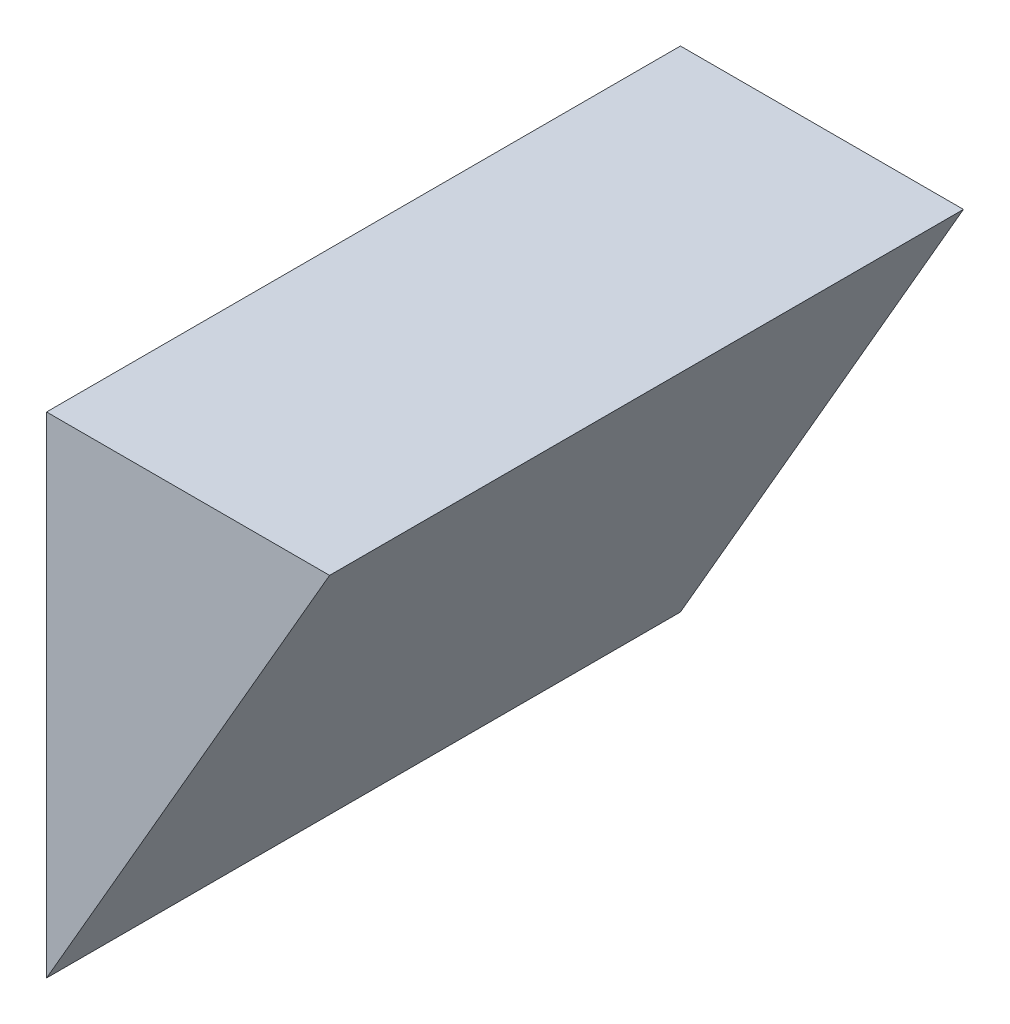
ISO-10303-21;
HEADER;
FILE_DESCRIPTION(('STEP AP214'),'2;1');
FILE_NAME('part.step','',(''),(''),'','','');
FILE_SCHEMA(('AUTOMOTIVE_DESIGN { 1 0 10303 214 1 1 1 1 }'));
ENDSEC;
DATA;
#1=APPLICATION_CONTEXT('core data for automotive mechanical design processes');
#2=APPLICATION_PROTOCOL_DEFINITION('international standard','automotive_design',2000,#1);
#3=PRODUCT_CONTEXT('',#1,'mechanical');
#4=PRODUCT('Part','Part','',(#3));
#5=PRODUCT_RELATED_PRODUCT_CATEGORY('part','',(#4));
#6=PRODUCT_DEFINITION_FORMATION('','',#4);
#7=PRODUCT_DEFINITION_CONTEXT('part definition',#1,'design');
#8=PRODUCT_DEFINITION('design','',#6,#7);
#9=PRODUCT_DEFINITION_SHAPE('','',#8);
#10=(LENGTH_UNIT() NAMED_UNIT(*) SI_UNIT(.MILLI.,.METRE.));
#11=(NAMED_UNIT(*) PLANE_ANGLE_UNIT() SI_UNIT($,.RADIAN.));
#12=(NAMED_UNIT(*) SI_UNIT($,.STERADIAN.) SOLID_ANGLE_UNIT());
#13=UNCERTAINTY_MEASURE_WITH_UNIT(LENGTH_MEASURE(1.E-05),#10,'distance_accuracy_value','');
#14=(GEOMETRIC_REPRESENTATION_CONTEXT(3) GLOBAL_UNCERTAINTY_ASSIGNED_CONTEXT((#13)) GLOBAL_UNIT_ASSIGNED_CONTEXT((#10,
#11,#12)) REPRESENTATION_CONTEXT('',''));
#15=CARTESIAN_POINT('',(0.,0.,0.));
#16=DIRECTION('',(0.,0.,1.));
#17=DIRECTION('',(1.,0.,0.));
#18=AXIS2_PLACEMENT_3D('',#15,#16,#17);
#19=CARTESIAN_POINT('',(8.93,0.,20.));
#20=DIRECTION('',(0.,-1.,0.));
#21=DIRECTION('',(1.,0.,0.));
#22=AXIS2_PLACEMENT_3D('',#19,#20,#21);
#23=PLANE('',#22);
#24=DIRECTION('',(-1.,0.,0.));
#25=VECTOR('',#24,1.);
#26=CARTESIAN_POINT('',(8.93,0.,0.));
#27=LINE('',#26,#25);
#28=CARTESIAN_POINT('',(8.93,0.,0.));
#29=VERTEX_POINT('',#28);
#30=CARTESIAN_POINT('',(0.,0.,0.));
#31=VERTEX_POINT('',#30);
#32=EDGE_CURVE('E95',#29,#31,#27,.T.);
#33=ORIENTED_EDGE('',*,*,#32,.T.);
#34=DIRECTION('',(0.,0.,-1.));
#35=VECTOR('',#34,1.);
#36=CARTESIAN_POINT('',(0.,0.,20.));
#37=LINE('',#36,#35);
#38=CARTESIAN_POINT('',(0.,0.,20.));
#39=VERTEX_POINT('',#38);
#40=EDGE_CURVE('E11',#39,#31,#37,.T.);
#41=ORIENTED_EDGE('',*,*,#40,.F.);
#42=DIRECTION('',(-1.,0.,0.));
#43=VECTOR('',#42,1.);
#44=CARTESIAN_POINT('',(8.93,0.,20.));
#45=LINE('',#44,#43);
#46=CARTESIAN_POINT('',(8.93,0.,20.));
#47=VERTEX_POINT('',#46);
#48=EDGE_CURVE('E87',#47,#39,#45,.T.);
#49=ORIENTED_EDGE('',*,*,#48,.F.);
#50=DIRECTION('',(0.,0.,-1.));
#51=VECTOR('',#50,1.);
#52=CARTESIAN_POINT('',(8.93,0.,20.));
#53=LINE('',#52,#51);
#54=EDGE_CURVE('E96',#47,#29,#53,.T.);
#55=ORIENTED_EDGE('',*,*,#54,.T.);
#56=EDGE_LOOP('',(#33,#41,#49,#55));
#57=FACE_BOUND('',#56,.T.);
#58=ADVANCED_FACE('F45',(#57),#23,.F.);
#59=CARTESIAN_POINT('',(0.,0.,20.));
#60=DIRECTION('',(1.,0.,0.));
#61=DIRECTION('',(0.,1.,0.));
#62=AXIS2_PLACEMENT_3D('',#59,#60,#61);
#63=PLANE('',#62);
#64=DIRECTION('',(0.,-1.,0.));
#65=VECTOR('',#64,1.);
#66=CARTESIAN_POINT('',(0.,0.,0.));
#67=LINE('',#66,#65);
#68=CARTESIAN_POINT('',(0.,-15.4672137115903,0.));
#69=VERTEX_POINT('',#68);
#70=EDGE_CURVE('E74',#31,#69,#67,.T.);
#71=ORIENTED_EDGE('',*,*,#70,.T.);
#72=DIRECTION('',(0.,0.,-1.));
#73=VECTOR('',#72,1.);
#74=CARTESIAN_POINT('',(0.,-15.4672137115903,20.));
#75=LINE('',#74,#73);
#76=CARTESIAN_POINT('',(0.,-15.4672137115903,20.));
#77=VERTEX_POINT('',#76);
#78=EDGE_CURVE('E54',#77,#69,#75,.T.);
#79=ORIENTED_EDGE('',*,*,#78,.F.);
#80=DIRECTION('',(0.,-1.,0.));
#81=VECTOR('',#80,1.);
#82=CARTESIAN_POINT('',(0.,0.,20.));
#83=LINE('',#82,#81);
#84=EDGE_CURVE('E82',#39,#77,#83,.T.);
#85=ORIENTED_EDGE('',*,*,#84,.F.);
#86=ORIENTED_EDGE('',*,*,#40,.T.);
#87=EDGE_LOOP('',(#71,#79,#85,#86));
#88=FACE_BOUND('',#87,.T.);
#89=ADVANCED_FACE('F83',(#88),#63,.F.);
#90=CARTESIAN_POINT('',(0.,-15.4672137115903,20.));
#91=DIRECTION('',(-0.866025403784442,0.499999999999995,0.));
#92=DIRECTION('',(-0.499999999999995,-0.866025403784442,0.));
#93=AXIS2_PLACEMENT_3D('',#90,#91,#92);
#94=PLANE('',#93);
#95=DIRECTION('',(0.499999999999995,0.866025403784442,0.));
#96=VECTOR('',#95,1.);
#97=CARTESIAN_POINT('',(0.,-15.4672137115903,0.));
#98=LINE('',#97,#96);
#99=EDGE_CURVE('E79',#69,#29,#98,.T.);
#100=ORIENTED_EDGE('',*,*,#99,.T.);
#101=ORIENTED_EDGE('',*,*,#54,.F.);
#102=DIRECTION('',(0.499999999999995,0.866025403784442,0.));
#103=VECTOR('',#102,1.);
#104=CARTESIAN_POINT('',(0.,-15.4672137115903,20.));
#105=LINE('',#104,#103);
#106=EDGE_CURVE('E62',#77,#47,#105,.T.);
#107=ORIENTED_EDGE('',*,*,#106,.F.);
#108=ORIENTED_EDGE('',*,*,#78,.T.);
#109=EDGE_LOOP('',(#100,#101,#107,#108));
#110=FACE_BOUND('',#109,.T.);
#111=ADVANCED_FACE('F108',(#110),#94,.F.);
#112=CARTESIAN_POINT('',(0.,0.,20.));
#113=DIRECTION('',(0.,0.,1.));
#114=DIRECTION('',(1.,0.,0.));
#115=AXIS2_PLACEMENT_3D('',#112,#113,#114);
#116=PLANE('',#115);
#117=ORIENTED_EDGE('',*,*,#48,.T.);
#118=ORIENTED_EDGE('',*,*,#84,.T.);
#119=ORIENTED_EDGE('',*,*,#106,.T.);
#120=EDGE_LOOP('',(#117,#118,#119));
#121=FACE_BOUND('',#120,.T.);
#122=ADVANCED_FACE('F90',(#121),#116,.T.);
#123=CARTESIAN_POINT('',(0.,0.,0.));
#124=DIRECTION('',(0.,0.,1.));
#125=DIRECTION('',(1.,0.,0.));
#126=AXIS2_PLACEMENT_3D('',#123,#124,#125);
#127=PLANE('',#126);
#128=ORIENTED_EDGE('',*,*,#32,.F.);
#129=ORIENTED_EDGE('',*,*,#99,.F.);
#130=ORIENTED_EDGE('',*,*,#70,.F.);
#131=EDGE_LOOP('',(#128,#129,#130));
#132=FACE_BOUND('',#131,.T.);
#133=ADVANCED_FACE('F109',(#132),#127,.F.);
#134=CLOSED_SHELL('',(#58,#89,#111,#122,#133));
#135=MANIFOLD_SOLID_BREP('B2',#134);
#136=ADVANCED_BREP_SHAPE_REPRESENTATION('',(#18,#135),#14);
#137=SHAPE_DEFINITION_REPRESENTATION(#9,#136);
ENDSEC;
END-ISO-10303-21;
